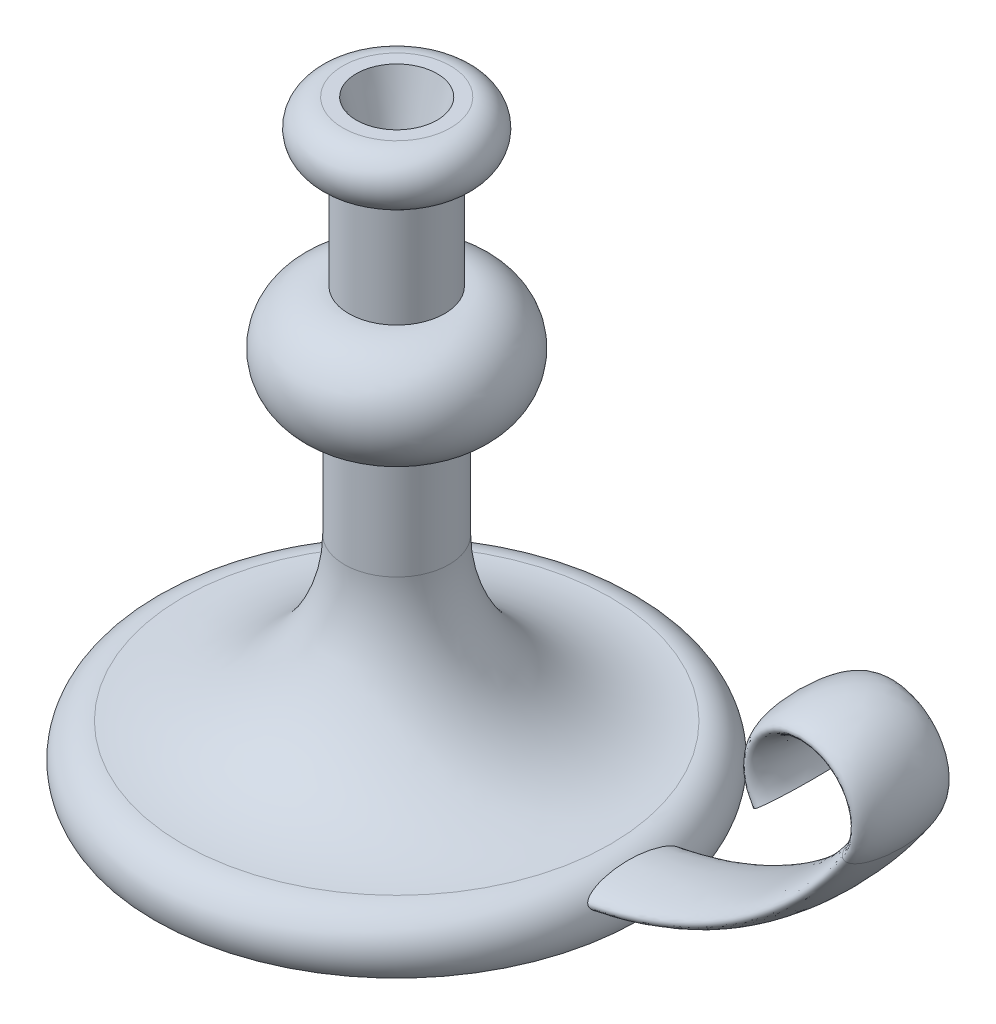
ISO-10303-21;
HEADER;
FILE_DESCRIPTION(('STEP AP214'),'2;1');
FILE_NAME('part.step','',(''),(''),'','','');
FILE_SCHEMA(('AUTOMOTIVE_DESIGN { 1 0 10303 214 1 1 1 1 }'));
ENDSEC;
DATA;
#1=APPLICATION_CONTEXT('core data for automotive mechanical design processes');
#2=APPLICATION_PROTOCOL_DEFINITION('international standard','automotive_design',2000,#1);
#3=PRODUCT_CONTEXT('',#1,'mechanical');
#4=PRODUCT('Part','Part','',(#3));
#5=PRODUCT_RELATED_PRODUCT_CATEGORY('part','',(#4));
#6=PRODUCT_DEFINITION_FORMATION('','',#4);
#7=PRODUCT_DEFINITION_CONTEXT('part definition',#1,'design');
#8=PRODUCT_DEFINITION('design','',#6,#7);
#9=PRODUCT_DEFINITION_SHAPE('','',#8);
#10=(LENGTH_UNIT() NAMED_UNIT(*) SI_UNIT(.MILLI.,.METRE.));
#11=(NAMED_UNIT(*) PLANE_ANGLE_UNIT() SI_UNIT($,.RADIAN.));
#12=(NAMED_UNIT(*) SI_UNIT($,.STERADIAN.) SOLID_ANGLE_UNIT());
#13=UNCERTAINTY_MEASURE_WITH_UNIT(LENGTH_MEASURE(1.E-05),#10,'distance_accuracy_value','');
#14=(GEOMETRIC_REPRESENTATION_CONTEXT(3) GLOBAL_UNCERTAINTY_ASSIGNED_CONTEXT((#13)) GLOBAL_UNIT_ASSIGNED_CONTEXT((#10,
#11,#12)) REPRESENTATION_CONTEXT('',''));
#15=CARTESIAN_POINT('',(0.,0.,0.));
#16=DIRECTION('',(0.,0.,1.));
#17=DIRECTION('',(1.,0.,0.));
#18=AXIS2_PLACEMENT_3D('',#15,#16,#17);
#19=CARTESIAN_POINT('',(0.,220.,0.));
#20=DIRECTION('',(0.,-1.,0.));
#21=DIRECTION('',(0.,0.,-1.));
#22=AXIS2_PLACEMENT_3D('',#19,#20,#21);
#23=PLANE('',#22);
#24=CARTESIAN_POINT('',(0.,220.,0.));
#25=DIRECTION('',(0.,1.,0.));
#26=DIRECTION('',(0.,0.,1.));
#27=AXIS2_PLACEMENT_3D('',#24,#25,#26);
#28=CIRCLE('',#27,15.);
#29=CARTESIAN_POINT('',(0.,220.,15.));
#30=VERTEX_POINT('',#29);
#31=EDGE_CURVE('E93',#30,#30,#28,.T.);
#32=ORIENTED_EDGE('',*,*,#31,.F.);
#33=EDGE_LOOP('',(#32));
#34=FACE_BOUND('',#33,.T.);
#35=CARTESIAN_POINT('',(0.,220.,0.));
#36=DIRECTION('',(0.,1.,0.));
#37=DIRECTION('',(0.,0.,1.));
#38=AXIS2_PLACEMENT_3D('',#35,#36,#37);
#39=CIRCLE('',#38,20.);
#40=CARTESIAN_POINT('',(0.,220.,20.));
#41=VERTEX_POINT('',#40);
#42=EDGE_CURVE('E10',#41,#41,#39,.T.);
#43=ORIENTED_EDGE('',*,*,#42,.T.);
#44=EDGE_LOOP('',(#43));
#45=FACE_BOUND('',#44,.T.);
#46=ADVANCED_FACE('F41',(#34,#45),#23,.F.);
#47=CARTESIAN_POINT('',(0.,210.,0.));
#48=DIRECTION('',(0.,1.,0.));
#49=DIRECTION('',(0.,0.,1.));
#50=AXIS2_PLACEMENT_3D('',#47,#48,#49);
#51=TOROIDAL_SURFACE('',#50,20.,10.);
#52=ORIENTED_EDGE('',*,*,#42,.F.);
#53=EDGE_LOOP('',(#52));
#54=FACE_BOUND('',#53,.T.);
#55=CARTESIAN_POINT('',(0.,200.243033800695,0.));
#56=DIRECTION('',(0.,1.,0.));
#57=DIRECTION('',(0.,0.,1.));
#58=AXIS2_PLACEMENT_3D('',#55,#56,#57);
#59=CIRCLE('',#58,17.8087422366111);
#60=CARTESIAN_POINT('',(0.,200.243033800695,17.8087422366111));
#61=VERTEX_POINT('',#60);
#62=EDGE_CURVE('E54',#61,#61,#59,.T.);
#63=ORIENTED_EDGE('',*,*,#62,.T.);
#64=EDGE_LOOP('',(#63));
#65=FACE_BOUND('',#64,.T.);
#66=ADVANCED_FACE('F101',(#54,#65),#51,.T.);
#67=CARTESIAN_POINT('',(0.,220.,0.));
#68=DIRECTION('',(0.,1.,0.));
#69=DIRECTION('',(0.,0.,1.));
#70=AXIS2_PLACEMENT_3D('',#67,#68,#69);
#71=CYLINDRICAL_SURFACE('',#70,17.8087422366111);
#72=ORIENTED_EDGE('',*,*,#62,.F.);
#73=EDGE_LOOP('',(#72));
#74=FACE_BOUND('',#73,.T.);
#75=CARTESIAN_POINT('',(0.,159.136592105591,0.));
#76=DIRECTION('',(0.,1.,0.));
#77=DIRECTION('',(0.,0.,1.));
#78=AXIS2_PLACEMENT_3D('',#75,#76,#77);
#79=CIRCLE('',#78,17.8087422366111);
#80=CARTESIAN_POINT('',(0.,159.136592105591,17.8087422366111));
#81=VERTEX_POINT('',#80);
#82=EDGE_CURVE('E59',#81,#81,#79,.T.);
#83=ORIENTED_EDGE('',*,*,#82,.T.);
#84=EDGE_LOOP('',(#83));
#85=FACE_BOUND('',#84,.T.);
#86=ADVANCED_FACE('F105',(#74,#85),#71,.T.);
#87=CARTESIAN_POINT('',(0.,139.204035757498,0.));
#88=DIRECTION('',(0.,1.,0.));
#89=DIRECTION('',(0.,0.,1.));
#90=AXIS2_PLACEMENT_3D('',#87,#88,#89);
#91=DEGENERATE_TOROIDAL_SURFACE('',#90,19.4498386475756,20.,.T.);
#92=ORIENTED_EDGE('',*,*,#82,.F.);
#93=EDGE_LOOP('',(#92));
#94=FACE_BOUND('',#93,.T.);
#95=CARTESIAN_POINT('',(0.,119.204035757498,0.));
#96=DIRECTION('',(0.,1.,0.));
#97=DIRECTION('',(0.,0.,1.));
#98=AXIS2_PLACEMENT_3D('',#95,#96,#97);
#99=CIRCLE('',#98,19.4498386475756);
#100=CARTESIAN_POINT('',(0.,119.204035757498,19.4498386475756));
#101=VERTEX_POINT('',#100);
#102=EDGE_CURVE('E65',#101,#101,#99,.T.);
#103=ORIENTED_EDGE('',*,*,#102,.T.);
#104=EDGE_LOOP('',(#103));
#105=FACE_BOUND('',#104,.T.);
#106=ADVANCED_FACE('F110',(#94,#105),#91,.T.);
#107=CARTESIAN_POINT('',(0.,220.,0.));
#108=DIRECTION('',(0.,1.,0.));
#109=DIRECTION('',(0.,0.,1.));
#110=AXIS2_PLACEMENT_3D('',#107,#108,#109);
#111=CYLINDRICAL_SURFACE('',#110,19.4498386475756);
#112=ORIENTED_EDGE('',*,*,#102,.F.);
#113=EDGE_LOOP('',(#112));
#114=FACE_BOUND('',#113,.T.);
#115=CARTESIAN_POINT('',(0.,79.2040357574979,0.));
#116=DIRECTION('',(0.,1.,0.));
#117=DIRECTION('',(0.,0.,1.));
#118=AXIS2_PLACEMENT_3D('',#115,#116,#117);
#119=CIRCLE('',#118,19.4498386475756);
#120=CARTESIAN_POINT('',(0.,79.2040357574979,19.4498386475756));
#121=VERTEX_POINT('',#120);
#122=EDGE_CURVE('E69',#121,#121,#119,.T.);
#123=ORIENTED_EDGE('',*,*,#122,.T.);
#124=EDGE_LOOP('',(#123));
#125=FACE_BOUND('',#124,.T.);
#126=ADVANCED_FACE('F117',(#114,#125),#111,.T.);
#127=CARTESIAN_POINT('',(0.,79.2040357574979,0.));
#128=DIRECTION('',(0.,1.,0.));
#129=DIRECTION('',(0.,0.,1.));
#130=AXIS2_PLACEMENT_3D('',#127,#128,#129);
#131=TOROIDAL_SURFACE('',#130,79.4498386475756,60.);
#132=ORIENTED_EDGE('',*,*,#122,.F.);
#133=EDGE_LOOP('',(#132));
#134=FACE_BOUND('',#133,.T.);
#135=CARTESIAN_POINT('',(0.,19.2040357574979,0.));
#136=DIRECTION('',(0.,1.,0.));
#137=DIRECTION('',(0.,0.,1.));
#138=AXIS2_PLACEMENT_3D('',#135,#136,#137);
#139=CIRCLE('',#138,79.4498386475756);
#140=CARTESIAN_POINT('',(0.,19.2040357574979,79.4498386475756));
#141=VERTEX_POINT('',#140);
#142=EDGE_CURVE('E73',#141,#141,#139,.T.);
#143=ORIENTED_EDGE('',*,*,#142,.T.);
#144=EDGE_LOOP('',(#143));
#145=FACE_BOUND('',#144,.T.);
#146=ADVANCED_FACE('F121',(#134,#145),#131,.F.);
#147=CARTESIAN_POINT('',(0.,6.70403575749789,0.));
#148=DIRECTION('',(0.,1.,0.));
#149=DIRECTION('',(0.,0.,1.));
#150=AXIS2_PLACEMENT_3D('',#147,#148,#149);
#151=TOROIDAL_SURFACE('',#150,79.4498386475756,12.5);
#152=CARTESIAN_POINT('',(88.6713682501329,12.7656539979028,-17.5));
#153=CARTESIAN_POINT('',(88.6954646232696,12.7230195467761,-17.4999988656331));
#154=CARTESIAN_POINT('',(88.7196518716515,12.6804274512962,-17.497725629414));
#155=CARTESIAN_POINT('',(88.7680077822172,12.595695491219,-17.4887280169395));
#156=CARTESIAN_POINT('',(88.792176428836,12.553555865983,-17.4820013923373));
#157=CARTESIAN_POINT('',(88.864451656765,12.4281790652521,-17.4554077162354));
#158=CARTESIAN_POINT('',(88.9122708150007,12.3460843280532,-17.4291276240366));
#159=CARTESIAN_POINT('',(89.0197689906856,12.1634088955128,-17.3524116042994));
#160=CARTESIAN_POINT('',(89.0787822844962,12.0645244843261,-17.297135187465));
#161=CARTESIAN_POINT('',(89.1926902264424,11.8760462237737,-17.169246947741));
#162=CARTESIAN_POINT('',(89.2475749829251,11.7864745023893,-17.096595131284));
#163=CARTESIAN_POINT('',(89.346780244329,11.6264838295284,-16.9487732929765));
#164=CARTESIAN_POINT('',(89.391574640789,11.555059572809,-16.8749776682736));
#165=CARTESIAN_POINT('',(89.4782828991231,11.4181682036325,-16.7204274066336));
#166=CARTESIAN_POINT('',(89.520194291834,11.3527061823902,-16.6396669347939));
#167=CARTESIAN_POINT('',(89.6014847931527,11.2269190329452,-16.4728157244288));
#168=CARTESIAN_POINT('',(89.6408591318149,11.1666035154914,-16.3867155103941));
#169=CARTESIAN_POINT('',(89.7172810392473,11.0505657915759,-16.2105502434478));
#170=CARTESIAN_POINT('',(89.7543292730077,10.9948422709108,-16.1204863363217));
#171=CARTESIAN_POINT('',(89.8313568560902,10.8799468333875,-15.9245543286195));
#172=CARTESIAN_POINT('',(89.8710327467942,10.8213641716089,-15.818223417467));
#173=CARTESIAN_POINT('',(89.9480485827265,10.7086486958567,-15.6024079573688));
#174=CARTESIAN_POINT('',(89.9853882602808,10.6545163915647,-15.4929230491421));
#175=CARTESIAN_POINT('',(90.0579321401532,10.5502176179766,-15.2716259567996));
#176=CARTESIAN_POINT('',(90.0931396070981,10.500045048285,-15.15981770163));
#177=CARTESIAN_POINT('',(90.1616923313702,10.4031135585256,-14.9341862768304));
#178=CARTESIAN_POINT('',(90.1950376963706,10.3563544410324,-14.8203632242051));
#179=CARTESIAN_POINT('',(90.2709963015747,10.2506204304672,-14.5524185045431));
#180=CARTESIAN_POINT('',(90.3129471856537,10.1928372056266,-14.3976391980201));
#181=CARTESIAN_POINT('',(90.3941798096954,10.0819512562281,-14.0857102285019));
#182=CARTESIAN_POINT('',(90.4334611721201,10.0288491933909,-13.9285602340557));
#183=CARTESIAN_POINT('',(90.5096552951397,9.92670621462019,-13.6121772634313));
#184=CARTESIAN_POINT('',(90.5465653407614,9.87766993567247,-13.4529421423826));
#185=CARTESIAN_POINT('',(90.6181795902394,9.78326838753293,-13.1328914732465));
#186=CARTESIAN_POINT('',(90.6528836507516,9.73790335684536,-12.9720758232391));
#187=CARTESIAN_POINT('',(90.7539836433824,9.60669797468647,-12.48750035934));
#188=CARTESIAN_POINT('',(90.8173322469873,9.52579415387324,-12.1617598905871));
#189=CARTESIAN_POINT('',(90.9372315484716,9.37451684027112,-11.5048374928293));
#190=CARTESIAN_POINT('',(90.9937456766035,9.30419954197437,-11.1736362133443));
#191=CARTESIAN_POINT('',(91.1002792176806,9.17304903043595,-10.508607032168));
#192=CARTESIAN_POINT('',(91.1503035643262,9.11220860548339,-10.1747813328471));
#193=CARTESIAN_POINT('',(91.2444235929463,8.99878881088646,-9.50496654670854));
#194=CARTESIAN_POINT('',(91.2885201979408,8.94620815488215,-9.16897780526011));
#195=CARTESIAN_POINT('',(91.3704127412438,8.84933215178203,-8.50152837269886));
#196=CARTESIAN_POINT('',(91.4083106841638,8.80490079656211,-8.17009981468851));
#197=CARTESIAN_POINT('',(91.479054614121,8.72251536210084,-7.5059006804377));
#198=CARTESIAN_POINT('',(91.5119004364291,8.68456149405953,-7.17313006080096));
#199=CARTESIAN_POINT('',(91.6032051947941,8.57963928060594,-6.17305937036119));
#200=CARTESIAN_POINT('',(91.6544153716628,8.52162910557553,-5.50413304131444));
#201=CARTESIAN_POINT('',(91.7385558898794,8.42692535767424,-4.16532551013828));
#202=CARTESIAN_POINT('',(91.7715301655684,8.39018054180269,-3.49545053561516));
#203=CARTESIAN_POINT('',(91.820020993095,8.33630718206151,-2.15426795138992));
#204=CARTESIAN_POINT('',(91.8355371686532,8.31917906099592,-1.48296031112157));
#205=CARTESIAN_POINT('',(91.8485685411796,8.30479148809854,-0.219110640926699));
#206=CARTESIAN_POINT('',(91.8479896625358,8.30542839147506,0.373390336974927));
#207=CARTESIAN_POINT('',(91.8334469587873,8.32149004711487,1.55812106375695));
#208=CARTESIAN_POINT('',(91.8194811679718,8.33691697111913,2.15035076002534));
#209=CARTESIAN_POINT('',(91.7779622296523,8.38302578713223,3.33393810179396));
#210=CARTESIAN_POINT('',(91.7504047466588,8.41371254676235,3.92529540860991));
#211=CARTESIAN_POINT('',(91.6812505206786,8.49135422840118,5.10681352279673));
#212=CARTESIAN_POINT('',(91.6396376593192,8.53832782941903,5.69697217035423));
#213=CARTESIAN_POINT('',(91.5417019414473,8.65012850108717,6.87427114547451));
#214=CARTESIAN_POINT('',(91.4853829277343,8.71495090798587,7.4614122207373));
#215=CARTESIAN_POINT('',(91.3890465711045,8.82749368000177,8.33867663899859));
#216=CARTESIAN_POINT('',(91.3549677574925,8.86754800305068,8.63045388783773));
#217=CARTESIAN_POINT('',(91.2826505945825,8.95322673154108,9.21266746850057));
#218=CARTESIAN_POINT('',(91.2444124309887,8.99885088831486,9.50310385958709));
#219=CARTESIAN_POINT('',(91.1635205756521,9.09624004686412,10.0823714273531));
#220=CARTESIAN_POINT('',(91.1208663281991,9.14800582160703,10.3712023971796));
#221=CARTESIAN_POINT('',(91.0308138805033,9.25841075805812,10.9468490992457));
#222=CARTESIAN_POINT('',(90.9834151272323,9.31705072117074,11.233664592378));
#223=CARTESIAN_POINT('',(90.8834164788879,9.44219033947745,11.804873237682));
#224=CARTESIAN_POINT('',(90.8308133373983,9.50869490560288,12.0892647561616));
#225=CARTESIAN_POINT('',(90.7198957881876,9.65075217329348,12.6544143303526));
#226=CARTESIAN_POINT('',(90.6615860960822,9.72629741539751,12.9351751726435));
#227=CARTESIAN_POINT('',(90.5384446122302,9.88818888596262,13.4920340645082));
#228=CARTESIAN_POINT('',(90.4736159018842,9.97453001609298,13.76813424567));
#229=CARTESIAN_POINT('',(90.3706329196514,10.1140026436299,14.1772876270643));
#230=CARTESIAN_POINT('',(90.3353655846426,10.1621300323086,14.3127800543586));
#231=CARTESIAN_POINT('',(90.262709484312,10.2621482157681,14.5817863164853));
#232=CARTESIAN_POINT('',(90.2253208998137,10.3140386898737,14.7153003187462));
#233=CARTESIAN_POINT('',(90.1413612709195,10.4316557859115,15.0033046351842));
#234=CARTESIAN_POINT('',(90.094335520918,10.4982065758267,15.1573298110569));
#235=CARTESIAN_POINT('',(89.9964963125112,10.6383463854755,15.4610191824846));
#236=CARTESIAN_POINT('',(89.9456812972864,10.7119383016098,15.6106815500637));
#237=CARTESIAN_POINT('',(89.8398728216737,10.8672084411169,15.9032851773567));
#238=CARTESIAN_POINT('',(89.7849012796717,10.9488448529358,16.0462560282458));
#239=CARTESIAN_POINT('',(89.6985439279567,11.0789625410436,16.2542187449256));
#240=CARTESIAN_POINT('',(89.6691172080211,11.1235982714472,16.3224386056235));
#241=CARTESIAN_POINT('',(89.6088276959795,11.2157298462253,16.4562527924469));
#242=CARTESIAN_POINT('',(89.5779652841249,11.2632249342516,16.5218478053132));
#243=CARTESIAN_POINT('',(89.5228217939976,11.3487507925928,16.6333201245411));
#244=CARTESIAN_POINT('',(89.4988948000605,11.3860655279914,16.679921744907));
#245=CARTESIAN_POINT('',(89.4501259115548,11.4625759557703,16.7710045343098));
#246=CARTESIAN_POINT('',(89.4252846015051,11.5017704511223,16.8154870177567));
#247=CARTESIAN_POINT('',(89.3745882895087,11.5822534930522,16.9020196171174));
#248=CARTESIAN_POINT('',(89.3487323848999,11.6235439143755,16.9440674807332));
#249=CARTESIAN_POINT('',(89.2959382593226,11.7083916915931,17.0252745091535));
#250=CARTESIAN_POINT('',(89.2689978741897,11.7519536374077,17.0644274054938));
#251=CARTESIAN_POINT('',(89.1858709311591,11.8872598838137,17.1774855693365));
#252=CARTESIAN_POINT('',(89.1279465031828,11.9827263546992,17.2459905375771));
#253=CARTESIAN_POINT('',(89.0380922651603,12.1329449103785,17.3330019086201));
#254=CARTESIAN_POINT('',(89.0076848280899,12.1841214291814,17.3593589434186));
#255=CARTESIAN_POINT('',(88.9459890174601,12.2886879760462,17.4059873517976));
#256=CARTESIAN_POINT('',(88.9147010856692,12.3420769002203,17.42626171971));
#257=CARTESIAN_POINT('',(88.8608312267869,12.4346402001143,17.4549034262224));
#258=CARTESIAN_POINT('',(88.8384005906809,12.473367491335,17.4650189777256));
#259=CARTESIAN_POINT('',(88.7933626976301,12.551500788524,17.48153864299));
#260=CARTESIAN_POINT('',(88.7707554894984,12.590906610306,17.4879437480894));
#261=CARTESIAN_POINT('',(88.7255219287056,12.6701203340183,17.4968584337037));
#262=CARTESIAN_POINT('',(88.7028955922219,12.709928015078,17.4993700481075));
#263=CARTESIAN_POINT('',(88.6577723149274,12.7896720066925,17.500421040912));
#264=CARTESIAN_POINT('',(88.6352753800472,12.829608323014,17.4989602386811));
#265=CARTESIAN_POINT('',(88.5905907450459,12.9092695969524,17.4920945979039));
#266=CARTESIAN_POINT('',(88.5684027982436,12.9489947054156,17.4866931140911));
#267=CARTESIAN_POINT('',(88.5244566605571,13.0279881259546,17.4720881973356));
#268=CARTESIAN_POINT('',(88.5026986268367,13.067256268897,17.4628834000039));
#269=CARTESIAN_POINT('',(88.4382400668091,13.1840175070922,17.4298685038622));
#270=CARTESIAN_POINT('',(88.3963538953364,13.2604695301755,17.4006577009954));
#271=CARTESIAN_POINT('',(88.2984837852678,13.4401683625377,17.3155492168989));
#272=CARTESIAN_POINT('',(88.2439182817653,13.541270196056,17.2536010349144));
#273=CARTESIAN_POINT('',(88.1404749112689,13.734030351861,17.1126302897185));
#274=CARTESIAN_POINT('',(88.0916120545395,13.8256636820681,17.0335641628777));
#275=CARTESIAN_POINT('',(88.0035665536252,13.991355516589,16.8721701933663));
#276=CARTESIAN_POINT('',(87.9639044744235,14.0662557015527,16.7909443321257));
#277=CARTESIAN_POINT('',(87.8880480801729,14.209745336551,16.6215302146521));
#278=CARTESIAN_POINT('',(87.8518568509441,14.2783291688106,16.5333358877173));
#279=CARTESIAN_POINT('',(87.7823385257299,14.4101166179349,16.351626182796));
#280=CARTESIAN_POINT('',(87.7490187196963,14.4733065371238,16.2580982083179));
#281=CARTESIAN_POINT('',(87.6848876579466,14.5948378999616,16.0671948562718));
#282=CARTESIAN_POINT('',(87.6540754893422,14.6531811081846,15.9698208981564));
#283=CARTESIAN_POINT('',(87.5939141933667,14.7669032248302,15.7698927371134));
#284=CARTESIAN_POINT('',(87.5646120443748,14.8221889192036,15.6672717366448));
#285=CARTESIAN_POINT('',(87.5078945291235,14.9289236693114,15.4595344727956));
#286=CARTESIAN_POINT('',(87.4804795012301,14.9803720371402,15.3544177664489));
#287=CARTESIAN_POINT('',(87.4005844084372,15.1298049575334,15.0357538139166));
#288=CARTESIAN_POINT('',(87.3505455127358,15.2227046836931,14.8192046899207));
#289=CARTESIAN_POINT('',(87.2554369641015,15.3977209621097,14.3805937129744));
#290=CARTESIAN_POINT('',(87.2103716870063,15.4798280308229,14.1585272129044));
#291=CARTESIAN_POINT('',(87.1240745636118,15.6354026369242,13.709542981605));
#292=CARTESIAN_POINT('',(87.0828605086582,15.7088304561678,13.4826081687364));
#293=CARTESIAN_POINT('',(87.0038464654084,15.8479370655072,13.026097648033));
#294=CARTESIAN_POINT('',(86.9660426780752,15.9136245040156,12.7965252082652));
#295=CARTESIAN_POINT('',(86.8933296395137,16.0383648044391,12.3352083355507));
#296=CARTESIAN_POINT('',(86.8584196374237,16.097419388827,12.1034644835091));
#297=CARTESIAN_POINT('',(86.7844180976847,16.2209419653029,11.5916870946004));
#298=CARTESIAN_POINT('',(86.7458865136081,16.2841307150251,11.3112647420562));
#299=CARTESIAN_POINT('',(86.6720920488979,16.4031949772332,10.7484316975062));
#300=CARTESIAN_POINT('',(86.6368294522458,16.4590698545261,10.4660208350444));
#301=CARTESIAN_POINT('',(86.5693098520677,16.564332755699,9.89950325772353));
#302=CARTESIAN_POINT('',(86.5370542456842,16.6137177685059,9.61539581917224));
#303=CARTESIAN_POINT('',(86.475415010256,16.7066016942248,9.04590579703074));
#304=CARTESIAN_POINT('',(86.4460315062993,16.7501003508017,8.7605231584676));
#305=CARTESIAN_POINT('',(86.3622466821833,16.8722653242646,7.90480141409807));
#306=CARTESIAN_POINT('',(86.3119765506171,16.9429608518148,7.3329043832305));
#307=CARTESIAN_POINT('',(86.222361217994,17.065951910534,6.18645401201974));
#308=CARTESIAN_POINT('',(86.1830137490044,17.1182512620059,5.61190124832689));
#309=CARTESIAN_POINT('',(86.1155751435718,17.2062459308639,4.46232985806448));
#310=CARTESIAN_POINT('',(86.0874559841474,17.2419826207143,3.88731602584737));
#311=CARTESIAN_POINT('',(86.0426822753868,17.2982442387359,2.73607647527276));
#312=CARTESIAN_POINT('',(86.026028330434,17.3187683649885,2.15985069463377));
#313=CARTESIAN_POINT('',(86.0044400821634,17.345282478697,1.00574212602362));
#314=CARTESIAN_POINT('',(85.9995283057652,17.3512445298202,0.427858279096074));
#315=CARTESIAN_POINT('',(86.0015803685067,17.3487419108469,-0.727840702177769));
#316=CARTESIAN_POINT('',(86.0085438340269,17.3402776946304,-1.30565583811386));
#317=CARTESIAN_POINT('',(86.0332849882587,17.3098027680869,-2.41864472513169));
#318=CARTESIAN_POINT('',(86.0502398555458,17.2888214031413,-2.95386520177914));
#319=CARTESIAN_POINT('',(86.094019508563,17.2336329605891,-4.02329613450103));
#320=CARTESIAN_POINT('',(86.1208455922483,17.1994241436896,-4.55750644846127));
#321=CARTESIAN_POINT('',(86.1840977954404,17.1167758037069,-5.62446475834952));
#322=CARTESIAN_POINT('',(86.2205274315657,17.0683310669832,-6.15721214623165));
#323=CARTESIAN_POINT('',(86.3026716413508,16.9558511939532,-7.21891808934937));
#324=CARTESIAN_POINT('',(86.348361413847,16.8918576125104,-7.74788293766671));
#325=CARTESIAN_POINT('',(86.4491195670039,16.7460406855707,-8.80235566521796));
#326=CARTESIAN_POINT('',(86.5041852298757,16.6642225049743,-9.3278645005274));
#327=CARTESIAN_POINT('',(86.5942621695393,16.5256514484999,-10.1123024169589));
#328=CARTESIAN_POINT('',(86.6255252432401,16.4768350220685,-10.3730777431112));
#329=CARTESIAN_POINT('',(86.6907173526699,16.3733317661398,-10.8931206992827));
#330=CARTESIAN_POINT('',(86.7246462186639,16.3186453103148,-11.1523884241659));
#331=CARTESIAN_POINT('',(86.7861221799904,16.2179127892057,-11.6012027488694));
#332=CARTESIAN_POINT('',(86.8130052142866,16.1733692564035,-11.7911780485925));
#333=CARTESIAN_POINT('',(86.8684961493393,16.0803380033942,-12.169911122204));
#334=CARTESIAN_POINT('',(86.8971040445574,16.0318502958516,-12.3586688999997));
#335=CARTESIAN_POINT('',(86.9562743337756,15.930417932598,-12.7349909079998));
#336=CARTESIAN_POINT('',(86.9868395981107,15.8774666937452,-12.922552920395));
#337=CARTESIAN_POINT('',(87.0501343150436,15.7666262056666,-13.2958436719774));
#338=CARTESIAN_POINT('',(87.082863695358,15.7087371213508,-13.4815724721578));
#339=CARTESIAN_POINT('',(87.1523283049283,15.584639640339,-13.858920135365));
#340=CARTESIAN_POINT('',(87.1891768123173,15.5181761602463,-14.0504349575872));
#341=CARTESIAN_POINT('',(87.2661130027605,15.3781083814942,-14.4301611534746));
#342=CARTESIAN_POINT('',(87.306200247319,15.3045050492365,-14.6183729701508));
#343=CARTESIAN_POINT('',(87.3902444234401,15.1489815543381,-14.9899554586679));
#344=CARTESIAN_POINT('',(87.4341918315661,15.0670817873263,-15.1733366702792));
#345=CARTESIAN_POINT('',(87.5038357487613,14.9365352869142,-15.4436745679758));
#346=CARTESIAN_POINT('',(87.5276649570793,14.8917481445206,-15.5329782524936));
#347=CARTESIAN_POINT('',(87.5767434857292,14.7993003453342,-15.7096770103544));
#348=CARTESIAN_POINT('',(87.6019927251947,14.7516398521585,-15.7970721919878));
#349=CARTESIAN_POINT('',(87.670740730804,14.6216656049518,-16.02458793079));
#350=CARTESIAN_POINT('',(87.7156100044897,14.5366338842782,-16.1627940543778));
#351=CARTESIAN_POINT('',(87.787095695995,14.4011051243168,-16.3634719094159));
#352=CARTESIAN_POINT('',(87.811655361579,14.3545339067781,-16.4293393780174));
#353=CARTESIAN_POINT('',(87.8623449583247,14.2584601397348,-16.5582632612128));
#354=CARTESIAN_POINT('',(87.8884745576105,14.2089582097998,-16.6213202650495));
#355=CARTESIAN_POINT('',(87.9428695478181,14.106031856428,-16.7447625907082));
#356=CARTESIAN_POINT('',(87.9711581365702,14.0525650806763,-16.8051029711455));
#357=CARTESIAN_POINT('',(88.0297824743806,13.941993435752,-16.9212638969147));
#358=CARTESIAN_POINT('',(88.0601188246039,13.8848874985021,-16.9770831042849));
#359=CARTESIAN_POINT('',(88.1543826527939,13.7079697253128,-17.135633731199));
#360=CARTESIAN_POINT('',(88.2218399307512,13.5820348051458,-17.2301172330313));
#361=CARTESIAN_POINT('',(88.3361171723849,13.3709561458757,-17.3502886692953));
#362=CARTESIAN_POINT('',(88.3796264499628,13.2910373800139,-17.3881803487757));
#363=CARTESIAN_POINT('',(88.447006095074,13.1682083581751,-17.4334436631719));
#364=CARTESIAN_POINT('',(88.469797199091,13.1268120079804,-17.4465957724372));
#365=CARTESIAN_POINT('',(88.5159836450599,13.0432627052848,-17.4687404248532));
#366=CARTESIAN_POINT('',(88.5393786671256,13.0011101567993,-17.4777351242523));
#367=CARTESIAN_POINT('',(88.5808510947299,12.9267133479078,-17.4896576840388));
#368=CARTESIAN_POINT('',(88.5988315759328,12.8945638157683,-17.4935307773354));
#369=CARTESIAN_POINT('',(88.6349801066691,12.8301527996008,-17.4987026723391));
#370=CARTESIAN_POINT('',(88.6531482000624,12.7978912906213,-17.5000008577317));
#371=CARTESIAN_POINT('',(88.6713682501329,12.7656539979028,-17.5));
#372=B_SPLINE_CURVE_WITH_KNOTS('',3,(#152,#153,#154,#155,#156,#157,#158,#159,#160,#161,#162,
#163,#164,#165,#166,#167,#168,#169,#170,#171,#172,#173,#174,#175,#176,#177,#178,#179,#180,#181,
#182,#183,#184,#185,#186,#187,#188,#189,#190,#191,#192,#193,#194,#195,#196,#197,#198,#199,#200,
#201,#202,#203,#204,#205,#206,#207,#208,#209,#210,#211,#212,#213,#214,#215,#216,#217,#218,#219,
#220,#221,#222,#223,#224,#225,#226,#227,#228,#229,#230,#231,#232,#233,#234,#235,#236,#237,#238,
#239,#240,#241,#242,#243,#244,#245,#246,#247,#248,#249,#250,#251,#252,#253,#254,#255,#256,#257,
#258,#259,#260,#261,#262,#263,#264,#265,#266,#267,#268,#269,#270,#271,#272,#273,#274,#275,#276,
#277,#278,#279,#280,#281,#282,#283,#284,#285,#286,#287,#288,#289,#290,#291,#292,#293,#294,#295,
#296,#297,#298,#299,#300,#301,#302,#303,#304,#305,#306,#307,#308,#309,#310,#311,#312,#313,#314,
#315,#316,#317,#318,#319,#320,#321,#322,#323,#324,#325,#326,#327,#328,#329,#330,#331,#332,#333,
#334,#335,#336,#337,#338,#339,#340,#341,#342,#343,#344,#345,#346,#347,#348,#349,#350,#351,#352,
#353,#354,#355,#356,#357,#358,#359,#360,#361,#362,#363,#364,#365,#366,#367,#368,#369,#370,#371),
.UNSPECIFIED.,.T.,.F.,(4,2,2,2,2,2,2,2,2,2,2,2,2,2,2,2,2,2,2,2,2,2,2,2,2,2,2,2,2,2,2,2,2,2,2,2,
2,2,2,2,2,2,2,2,2,2,2,2,2,2,2,2,2,2,2,2,2,2,2,2,2,2,2,2,2,2,2,2,2,2,2,2,2,2,2,2,2,2,2,2,2,2,2,2,
2,2,2,2,2,2,2,2,2,2,2,2,2,2,2,2,2,2,2,2,2,2,2,2,2,4),(0.,0.146876745031464,0.293827699159295,
0.588070381050187,0.969167162899156,1.35114971699201,1.68679849786003,2.02273125699659,
2.35927821129037,2.69572851081341,3.07871974499728,3.46175478070604,3.84418769807213,
4.22659847892487,4.73784202265977,5.24915771936351,5.76104876708308,6.27297304337736,
7.29729813919751,8.3268820595355,9.35567861859469,10.384314795743,11.3938033567832,
12.4033248261598,14.422771924944,16.4373322925452,18.451936079707,20.2291177759784,
22.0065604705027,23.7845705022714,25.5646264756251,27.3442177751035,28.2335861510161,
29.1229148351898,30.0123555668392,30.9019000943007,31.7920030468069,32.6813765744267,
33.5703316728101,34.0144139386598,34.4584584059517,34.9810156476871,35.503788777642,
36.0239752986998,36.2839183026267,36.5437928468078,36.736682587556,36.9294510863826,
37.1223951585226,37.315745468441,37.7067964742868,37.9018505727444,38.0968084932168,
38.2343192553447,38.3717932610793,38.5091954286591,38.6466038442195,38.7838954192005,
38.9212362885574,39.195910809291,39.585304443626,39.9757009490675,40.3273627472966,
40.6793343531817,41.0321747209027,41.3848860594885,41.7453418224178,42.1058620486071,
42.8280037736094,43.5507758644367,44.2767369999587,45.0018791617119,45.7268325751842,
46.5967663402946,47.4667756071077,48.3371871136972,49.2076365122225,50.94245013712,
52.6769032831904,54.4070002103236,56.1371883317128,57.8706931011479,59.6041433319641,
61.2115976062764,62.8192633185371,64.427518543781,66.0315220311223,67.6350613551238,
68.4364198741444,69.2377274107665,69.8285960722382,70.4194628365338,71.0112168352058,
71.6029510787077,72.2209259926093,72.8388173780475,73.4552250202263,73.7632874096877,
74.0713322736914,74.575802495756,74.8286860460491,75.081516324875,75.3376071361433,
75.5937734581774,76.1034743603315,76.3979892408205,76.5449830863944,76.6919006075529,
76.8029323104714,76.9139905860673),.UNSPECIFIED.);
#373=CARTESIAN_POINT('',(88.6713682501329,12.7656539979028,-17.5));
#374=VERTEX_POINT('',#373);
#375=EDGE_CURVE('E44',#374,#374,#372,.T.);
#376=ORIENTED_EDGE('',*,*,#375,.T.);
#377=EDGE_LOOP('',(#376));
#378=FACE_BOUND('',#377,.T.);
#379=ORIENTED_EDGE('',*,*,#142,.F.);
#380=EDGE_LOOP('',(#379));
#381=FACE_BOUND('',#380,.T.);
#382=CARTESIAN_POINT('',(0.,0.,0.));
#383=DIRECTION('',(0.,1.,0.));
#384=DIRECTION('',(0.,0.,1.));
#385=AXIS2_PLACEMENT_3D('',#382,#383,#384);
#386=CIRCLE('',#385,90.);
#387=CARTESIAN_POINT('',(0.,0.,90.));
#388=VERTEX_POINT('',#387);
#389=EDGE_CURVE('E77',#388,#388,#386,.T.);
#390=ORIENTED_EDGE('',*,*,#389,.T.);
#391=EDGE_LOOP('',(#390));
#392=FACE_BOUND('',#391,.T.);
#393=ADVANCED_FACE('F124',(#378,#381,#392),#151,.T.);
#394=CARTESIAN_POINT('',(0.,0.,0.));
#395=DIRECTION('',(0.,1.,0.));
#396=DIRECTION('',(0.,0.,1.));
#397=AXIS2_PLACEMENT_3D('',#394,#395,#396);
#398=PLANE('',#397);
#399=ORIENTED_EDGE('',*,*,#389,.F.);
#400=EDGE_LOOP('',(#399));
#401=FACE_BOUND('',#400,.T.);
#402=ADVANCED_FACE('F129',(#401),#398,.F.);
#403=CARTESIAN_POINT('',(60.,10.,-17.5));
#404=CARTESIAN_POINT('',(110.410191303973,10.,-17.5));
#405=CARTESIAN_POINT('',(155.026295870831,33.4646670673665,-17.5));
#406=CARTESIAN_POINT('',(183.592070943083,75.,-17.5));
#407=CARTESIAN_POINT('',(60.,20.,-17.5));
#408=CARTESIAN_POINT('',(107.049511883708,20.,-17.5));
#409=CARTESIAN_POINT('',(148.691209479443,41.900355929542,-17.5));
#410=CARTESIAN_POINT('',(175.352599546877,80.6666666666666,-17.5));
#411=CARTESIAN_POINT('',(60.,20.,17.5));
#412=CARTESIAN_POINT('',(107.049511883708,20.,17.5));
#413=CARTESIAN_POINT('',(148.691209479443,41.900355929542,17.5));
#414=CARTESIAN_POINT('',(175.352599546877,80.6666666666666,17.5));
#415=CARTESIAN_POINT('',(60.,10.,17.5));
#416=CARTESIAN_POINT('',(110.410191303973,10.,17.5));
#417=CARTESIAN_POINT('',(155.026295870831,33.4646670673665,17.5));
#418=CARTESIAN_POINT('',(183.592070943083,75.,17.5));
#419=CARTESIAN_POINT('',(60.,0.,17.5));
#420=CARTESIAN_POINT('',(113.770870724238,0.,17.5));
#421=CARTESIAN_POINT('',(161.36138226222,25.0289782051909,17.5));
#422=CARTESIAN_POINT('',(191.831542339288,69.3333333333333,17.5));
#423=CARTESIAN_POINT('',(60.,0.,-17.5));
#424=CARTESIAN_POINT('',(113.770870724238,0.,-17.5));
#425=CARTESIAN_POINT('',(161.36138226222,25.0289782051909,-17.5));
#426=CARTESIAN_POINT('',(191.831542339288,69.3333333333333,-17.5));
#427=CARTESIAN_POINT('',(60.,10.,-17.5));
#428=CARTESIAN_POINT('',(110.410191303973,10.,-17.5));
#429=CARTESIAN_POINT('',(155.026295870831,33.4646670673665,-17.5));
#430=CARTESIAN_POINT('',(183.592070943083,75.,-17.5));
#431=(BOUNDED_SURFACE() B_SPLINE_SURFACE(3,3,((#403,#404,#405,#406),(#407,#408,#409,#410),(#411,
#412,#413,#414),(#415,#416,#417,#418),(#419,#420,#421,#422),(#423,#424,#425,#426),(#427,#428,
#429,#430)),.UNSPECIFIED.,.T.,.F.,.F.) B_SPLINE_SURFACE_WITH_KNOTS((4,3,4),(4,4),(0.,0.5,1.),
(0.,1.),.UNSPECIFIED.) GEOMETRIC_REPRESENTATION_ITEM() RATIONAL_B_SPLINE_SURFACE(((1.,
0.923374135437856,0.923374135437856,1.),(0.333333333333333,0.307791378479285,0.307791378479285,
0.333333333333333),(0.333333333333333,0.307791378479285,0.307791378479285,0.333333333333333),
(1.,0.923374135437856,0.923374135437856,1.),(0.333333333333333,0.307791378479285,
0.307791378479285,0.333333333333333),(0.333333333333333,0.307791378479285,0.307791378479285,
0.333333333333333),(1.,0.923374135437856,0.923374135437856,1.))) REPRESENTATION_ITEM('') SURFACE());
#432=CARTESIAN_POINT('',(183.592070943083,75.,0.));
#433=DIRECTION('',(0.566666666666667,0.823947139620552,0.));
#434=DIRECTION('',(0.,0.,-1.));
#435=AXIS2_PLACEMENT_3D('',#432,#433,#434);
#436=ELLIPSE('',#435,17.5,5.);
#437=CARTESIAN_POINT('',(183.592070943083,75.,-17.5));
#438=VERTEX_POINT('',#437);
#439=EDGE_CURVE('E85',#438,#438,#436,.T.);
#440=ORIENTED_EDGE('',*,*,#439,.F.);
#441=EDGE_LOOP('',(#440));
#442=FACE_BOUND('',#441,.T.);
#443=ORIENTED_EDGE('',*,*,#375,.F.);
#444=EDGE_LOOP('',(#443));
#445=FACE_BOUND('',#444,.T.);
#446=ADVANCED_FACE('F133',(#442,#445),#431,.T.);
#447=CARTESIAN_POINT('',(150.634185358261,75.,0.));
#448=DIRECTION('',(0.566666666666666,-0.823947139620552,0.));
#449=DIRECTION('',(0.,0.,-1.));
#450=AXIS2_PLACEMENT_3D('',#447,#448,#449);
#451=PLANE('',#450);
#452=CARTESIAN_POINT('',(150.634185358261,75.,0.));
#453=DIRECTION('',(0.566666666666666,-0.823947139620552,0.));
#454=DIRECTION('',(0.,0.,-1.));
#455=AXIS2_PLACEMENT_3D('',#452,#453,#454);
#456=ELLIPSE('',#455,17.5,5.);
#457=CARTESIAN_POINT('',(150.634185358261,75.,-17.5));
#458=VERTEX_POINT('',#457);
#459=EDGE_CURVE('E81',#458,#458,#456,.T.);
#460=ORIENTED_EDGE('',*,*,#459,.T.);
#461=EDGE_LOOP('',(#460));
#462=FACE_BOUND('',#461,.T.);
#463=ADVANCED_FACE('F135',(#462),#451,.T.);
#464=CARTESIAN_POINT('',(183.592070943083,75.,-17.5));
#465=CARTESIAN_POINT('',(193.981461744242,90.10642735238,-17.5));
#466=CARTESIAN_POINT('',(185.447347211541,106.333333333333,-17.5));
#467=CARTESIAN_POINT('',(167.113128150672,106.333333333333,-17.5));
#468=CARTESIAN_POINT('',(148.778909089802,106.333333333333,-17.5));
#469=CARTESIAN_POINT('',(140.244794557101,90.1064273523801,-17.5));
#470=CARTESIAN_POINT('',(150.634185358261,75.,-17.5));
#471=CARTESIAN_POINT('',(175.352599546877,80.6666666666667,-17.5));
#472=CARTESIAN_POINT('',(180.547294947457,88.2198803428567,-17.5));
#473=CARTESIAN_POINT('',(176.280237681107,96.3333333333333,-17.5));
#474=CARTESIAN_POINT('',(167.113128150672,96.3333333333333,-17.5));
#475=CARTESIAN_POINT('',(157.946018620237,96.3333333333334,-17.5));
#476=CARTESIAN_POINT('',(153.678961353886,88.2198803428568,-17.5));
#477=CARTESIAN_POINT('',(158.873656754466,80.6666666666667,-17.5));
#478=CARTESIAN_POINT('',(175.352599546877,80.6666666666667,17.5));
#479=CARTESIAN_POINT('',(180.547294947457,88.2198803428567,17.5));
#480=CARTESIAN_POINT('',(176.280237681107,96.3333333333333,17.5));
#481=CARTESIAN_POINT('',(167.113128150672,96.3333333333333,17.5));
#482=CARTESIAN_POINT('',(157.946018620237,96.3333333333334,17.5));
#483=CARTESIAN_POINT('',(153.678961353886,88.2198803428568,17.5));
#484=CARTESIAN_POINT('',(158.873656754466,80.6666666666667,17.5));
#485=CARTESIAN_POINT('',(183.592070943083,75.,17.5));
#486=CARTESIAN_POINT('',(193.981461744242,90.10642735238,17.5));
#487=CARTESIAN_POINT('',(185.447347211541,106.333333333333,17.5));
#488=CARTESIAN_POINT('',(167.113128150672,106.333333333333,17.5));
#489=CARTESIAN_POINT('',(148.778909089802,106.333333333333,17.5));
#490=CARTESIAN_POINT('',(140.244794557101,90.1064273523801,17.5));
#491=CARTESIAN_POINT('',(150.634185358261,75.,17.5));
#492=CARTESIAN_POINT('',(191.831542339288,69.3333333333333,17.5));
#493=CARTESIAN_POINT('',(207.415628541028,91.9929743619034,17.5));
#494=CARTESIAN_POINT('',(194.614456741976,116.333333333333,17.5));
#495=CARTESIAN_POINT('',(167.113128150672,116.333333333333,17.5));
#496=CARTESIAN_POINT('',(139.611799559367,116.333333333333,17.5));
#497=CARTESIAN_POINT('',(126.810627760316,91.9929743619035,17.5));
#498=CARTESIAN_POINT('',(142.394713962055,69.3333333333334,17.5));
#499=CARTESIAN_POINT('',(191.831542339288,69.3333333333333,-17.5));
#500=CARTESIAN_POINT('',(207.415628541028,91.9929743619034,-17.5));
#501=CARTESIAN_POINT('',(194.614456741976,116.333333333333,-17.5));
#502=CARTESIAN_POINT('',(167.113128150672,116.333333333333,-17.5));
#503=CARTESIAN_POINT('',(139.611799559367,116.333333333333,-17.5));
#504=CARTESIAN_POINT('',(126.810627760316,91.9929743619035,-17.5));
#505=CARTESIAN_POINT('',(142.394713962055,69.3333333333334,-17.5));
#506=CARTESIAN_POINT('',(183.592070943083,75.,-17.5));
#507=CARTESIAN_POINT('',(193.981461744242,90.10642735238,-17.5));
#508=CARTESIAN_POINT('',(185.447347211541,106.333333333333,-17.5));
#509=CARTESIAN_POINT('',(167.113128150672,106.333333333333,-17.5));
#510=CARTESIAN_POINT('',(148.778909089802,106.333333333333,-17.5));
#511=CARTESIAN_POINT('',(140.244794557101,90.1064273523801,-17.5));
#512=CARTESIAN_POINT('',(150.634185358261,75.,-17.5));
#513=(BOUNDED_SURFACE() B_SPLINE_SURFACE(3,3,((#464,#465,#466,#467,#468,#469,#470),(#471,#472,
#473,#474,#475,#476,#477),(#478,#479,#480,#481,#482,#483,#484),(#485,#486,#487,#488,#489,#490,
#491),(#492,#493,#494,#495,#496,#497,#498),(#499,#500,#501,#502,#503,#504,#505),(#506,#507,#508,
#509,#510,#511,#512)),.UNSPECIFIED.,.T.,.F.,.F.) B_SPLINE_SURFACE_WITH_KNOTS((4,3,4),(4,3,4),
(0.,0.5,1.),(0.,0.5,1.),
.UNSPECIFIED.) GEOMETRIC_REPRESENTATION_ITEM() RATIONAL_B_SPLINE_SURFACE(((1.,0.643649778750421,
0.643649778750421,1.,0.643649778750421,0.643649778750421,1.),(0.333333333333333,
0.21454992625014,0.21454992625014,0.333333333333333,0.21454992625014,0.21454992625014,
0.333333333333333),(0.333333333333333,0.21454992625014,0.21454992625014,0.333333333333333,
0.21454992625014,0.21454992625014,0.333333333333333),(1.,0.643649778750421,0.643649778750421,1.,
0.643649778750421,0.643649778750421,1.),(0.333333333333333,0.21454992625014,0.21454992625014,
0.333333333333333,0.21454992625014,0.21454992625014,0.333333333333333),(0.333333333333333,
0.21454992625014,0.21454992625014,0.333333333333333,0.21454992625014,0.21454992625014,
0.333333333333333),(1.,0.643649778750421,0.643649778750421,1.,0.643649778750421,
0.643649778750421,1.))) REPRESENTATION_ITEM('') SURFACE());
#514=ORIENTED_EDGE('',*,*,#459,.F.);
#515=EDGE_LOOP('',(#514));
#516=FACE_BOUND('',#515,.T.);
#517=ORIENTED_EDGE('',*,*,#439,.T.);
#518=EDGE_LOOP('',(#517));
#519=FACE_BOUND('',#518,.T.);
#520=ADVANCED_FACE('F138',(#516,#519),#513,.T.);
#521=CARTESIAN_POINT('',(0.,220.,0.));
#522=DIRECTION('',(0.,1.,0.));
#523=DIRECTION('',(0.,0.,1.));
#524=AXIS2_PLACEMENT_3D('',#521,#522,#523);
#525=CONICAL_SURFACE('',#524,15.,0.26179938779915);
#526=CARTESIAN_POINT('',(0.,195.,0.));
#527=DIRECTION('',(0.,1.,0.));
#528=DIRECTION('',(0.,0.,1.));
#529=AXIS2_PLACEMENT_3D('',#526,#527,#528);
#530=CIRCLE('',#529,8.30127018922192);
#531=CARTESIAN_POINT('',(0.,195.,8.30127018922192));
#532=VERTEX_POINT('',#531);
#533=EDGE_CURVE('E89',#532,#532,#530,.T.);
#534=ORIENTED_EDGE('',*,*,#533,.F.);
#535=EDGE_LOOP('',(#534));
#536=FACE_BOUND('',#535,.T.);
#537=ORIENTED_EDGE('',*,*,#31,.T.);
#538=EDGE_LOOP('',(#537));
#539=FACE_BOUND('',#538,.T.);
#540=ADVANCED_FACE('F98',(#536,#539),#525,.F.);
#541=CARTESIAN_POINT('',(0.,195.,0.));
#542=DIRECTION('',(0.,1.,0.));
#543=DIRECTION('',(0.,0.,1.));
#544=AXIS2_PLACEMENT_3D('',#541,#542,#543);
#545=PLANE('',#544);
#546=ORIENTED_EDGE('',*,*,#533,.T.);
#547=EDGE_LOOP('',(#546));
#548=FACE_BOUND('',#547,.T.);
#549=ADVANCED_FACE('F162',(#548),#545,.T.);
#550=CLOSED_SHELL('',(#46,#66,#86,#106,#126,#146,#393,#402,#446,#463,#520,#540,#549));
#551=MANIFOLD_SOLID_BREP('B2',#550);
#552=ADVANCED_BREP_SHAPE_REPRESENTATION('',(#18,#551),#14);
#553=SHAPE_DEFINITION_REPRESENTATION(#9,#552);
ENDSEC;
END-ISO-10303-21;
